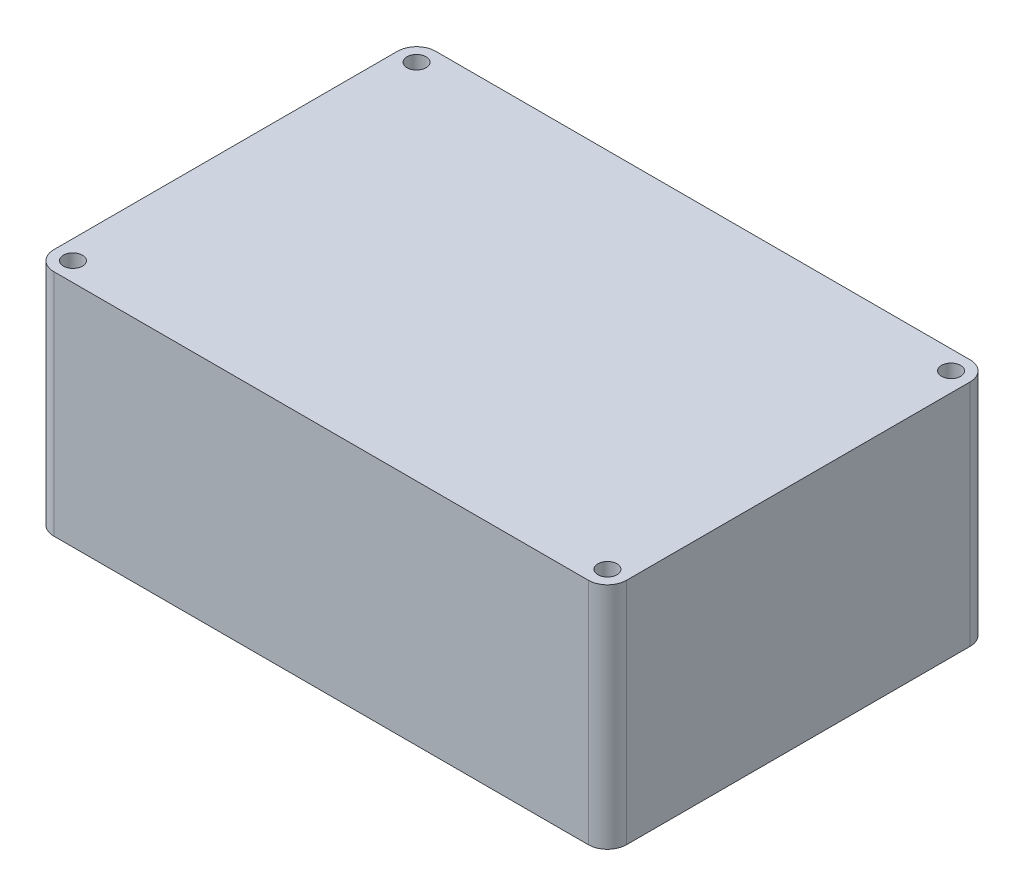
ISO-10303-21;
HEADER;
FILE_DESCRIPTION(('STEP AP214'),'2;1');
FILE_NAME('part.step','',(''),(''),'','','');
FILE_SCHEMA(('AUTOMOTIVE_DESIGN { 1 0 10303 214 1 1 1 1 }'));
ENDSEC;
DATA;
#1=APPLICATION_CONTEXT('core data for automotive mechanical design processes');
#2=APPLICATION_PROTOCOL_DEFINITION('international standard','automotive_design',2000,#1);
#3=PRODUCT_CONTEXT('',#1,'mechanical');
#4=PRODUCT('Part','Part','',(#3));
#5=PRODUCT_RELATED_PRODUCT_CATEGORY('part','',(#4));
#6=PRODUCT_DEFINITION_FORMATION('','',#4);
#7=PRODUCT_DEFINITION_CONTEXT('part definition',#1,'design');
#8=PRODUCT_DEFINITION('design','',#6,#7);
#9=PRODUCT_DEFINITION_SHAPE('','',#8);
#10=(LENGTH_UNIT() NAMED_UNIT(*) SI_UNIT(.MILLI.,.METRE.));
#11=(NAMED_UNIT(*) PLANE_ANGLE_UNIT() SI_UNIT($,.RADIAN.));
#12=(NAMED_UNIT(*) SI_UNIT($,.STERADIAN.) SOLID_ANGLE_UNIT());
#13=UNCERTAINTY_MEASURE_WITH_UNIT(LENGTH_MEASURE(1.E-05),#10,'distance_accuracy_value','');
#14=(GEOMETRIC_REPRESENTATION_CONTEXT(3) GLOBAL_UNCERTAINTY_ASSIGNED_CONTEXT((#13)) GLOBAL_UNIT_ASSIGNED_CONTEXT((#10,
#11,#12)) REPRESENTATION_CONTEXT('',''));
#15=CARTESIAN_POINT('',(0.,0.,0.));
#16=DIRECTION('',(0.,0.,1.));
#17=DIRECTION('',(1.,0.,0.));
#18=AXIS2_PLACEMENT_3D('',#15,#16,#17);
#19=CARTESIAN_POINT('',(-150.,120.,-100.));
#20=DIRECTION('',(1.,0.,0.));
#21=DIRECTION('',(0.,0.,-1.));
#22=AXIS2_PLACEMENT_3D('',#19,#20,#21);
#23=PLANE('',#22);
#24=DIRECTION('',(0.,0.,1.));
#25=VECTOR('',#24,1.);
#26=CARTESIAN_POINT('',(-150.,120.,-100.));
#27=LINE('',#26,#25);
#28=CARTESIAN_POINT('',(-150.,120.,-90.));
#29=VERTEX_POINT('',#28);
#30=CARTESIAN_POINT('',(-150.,120.,90.));
#31=VERTEX_POINT('',#30);
#32=EDGE_CURVE('E124',#29,#31,#27,.T.);
#33=ORIENTED_EDGE('',*,*,#32,.F.);
#34=DIRECTION('',(0.,-1.,0.));
#35=VECTOR('',#34,1.);
#36=CARTESIAN_POINT('',(-150.,120.,-90.));
#37=LINE('',#36,#35);
#38=CARTESIAN_POINT('',(-150.,0.,-90.));
#39=VERTEX_POINT('',#38);
#40=EDGE_CURVE('E109',#29,#39,#37,.T.);
#41=ORIENTED_EDGE('',*,*,#40,.T.);
#42=DIRECTION('',(0.,0.,1.));
#43=VECTOR('',#42,1.);
#44=CARTESIAN_POINT('',(-150.,0.,-100.));
#45=LINE('',#44,#43);
#46=CARTESIAN_POINT('',(-150.,0.,90.));
#47=VERTEX_POINT('',#46);
#48=EDGE_CURVE('E121',#39,#47,#45,.T.);
#49=ORIENTED_EDGE('',*,*,#48,.T.);
#50=DIRECTION('',(0.,-1.,0.));
#51=VECTOR('',#50,1.);
#52=CARTESIAN_POINT('',(-150.,120.,90.));
#53=LINE('',#52,#51);
#54=EDGE_CURVE('E126',#47,#31,#53,.F.);
#55=ORIENTED_EDGE('',*,*,#54,.T.);
#56=EDGE_LOOP('',(#33,#41,#49,#55));
#57=FACE_BOUND('',#56,.T.);
#58=ADVANCED_FACE('F39',(#57),#23,.F.);
#59=CARTESIAN_POINT('',(-150.,120.,100.));
#60=DIRECTION('',(0.,0.,-1.));
#61=DIRECTION('',(-1.,0.,0.));
#62=AXIS2_PLACEMENT_3D('',#59,#60,#61);
#63=PLANE('',#62);
#64=DIRECTION('',(1.,0.,0.));
#65=VECTOR('',#64,1.);
#66=CARTESIAN_POINT('',(-150.,0.,100.));
#67=LINE('',#66,#65);
#68=CARTESIAN_POINT('',(-140.,0.,100.));
#69=VERTEX_POINT('',#68);
#70=CARTESIAN_POINT('',(140.,0.,100.));
#71=VERTEX_POINT('',#70);
#72=EDGE_CURVE('E130',#69,#71,#67,.T.);
#73=ORIENTED_EDGE('',*,*,#72,.T.);
#74=DIRECTION('',(0.,-1.,0.));
#75=VECTOR('',#74,1.);
#76=CARTESIAN_POINT('',(140.,120.,100.));
#77=LINE('',#76,#75);
#78=CARTESIAN_POINT('',(140.,120.,100.));
#79=VERTEX_POINT('',#78);
#80=EDGE_CURVE('E11',#71,#79,#77,.F.);
#81=ORIENTED_EDGE('',*,*,#80,.T.);
#82=DIRECTION('',(1.,0.,0.));
#83=VECTOR('',#82,1.);
#84=CARTESIAN_POINT('',(-150.,120.,100.));
#85=LINE('',#84,#83);
#86=CARTESIAN_POINT('',(-140.,120.,100.));
#87=VERTEX_POINT('',#86);
#88=EDGE_CURVE('E170',#87,#79,#85,.T.);
#89=ORIENTED_EDGE('',*,*,#88,.F.);
#90=DIRECTION('',(0.,-1.,0.));
#91=VECTOR('',#90,1.);
#92=CARTESIAN_POINT('',(-140.,120.,100.));
#93=LINE('',#92,#91);
#94=EDGE_CURVE('E47',#87,#69,#93,.T.);
#95=ORIENTED_EDGE('',*,*,#94,.T.);
#96=EDGE_LOOP('',(#73,#81,#89,#95));
#97=FACE_BOUND('',#96,.T.);
#98=ADVANCED_FACE('F168',(#97),#63,.F.);
#99=CARTESIAN_POINT('',(150.,120.,-100.));
#100=DIRECTION('',(-1.,0.,0.));
#101=DIRECTION('',(0.,0.,1.));
#102=AXIS2_PLACEMENT_3D('',#99,#100,#101);
#103=PLANE('',#102);
#104=DIRECTION('',(0.,0.,-1.));
#105=VECTOR('',#104,1.);
#106=CARTESIAN_POINT('',(150.,0.,-100.));
#107=LINE('',#106,#105);
#108=CARTESIAN_POINT('',(150.,0.,90.));
#109=VERTEX_POINT('',#108);
#110=CARTESIAN_POINT('',(150.,0.,-90.));
#111=VERTEX_POINT('',#110);
#112=EDGE_CURVE('E134',#109,#111,#107,.T.);
#113=ORIENTED_EDGE('',*,*,#112,.T.);
#114=DIRECTION('',(0.,-1.,0.));
#115=VECTOR('',#114,1.);
#116=CARTESIAN_POINT('',(150.,120.,-90.));
#117=LINE('',#116,#115);
#118=CARTESIAN_POINT('',(150.,120.,-90.));
#119=VERTEX_POINT('',#118);
#120=EDGE_CURVE('E54',#111,#119,#117,.F.);
#121=ORIENTED_EDGE('',*,*,#120,.T.);
#122=DIRECTION('',(0.,0.,-1.));
#123=VECTOR('',#122,1.);
#124=CARTESIAN_POINT('',(150.,120.,-100.));
#125=LINE('',#124,#123);
#126=CARTESIAN_POINT('',(150.,120.,90.));
#127=VERTEX_POINT('',#126);
#128=EDGE_CURVE('E178',#127,#119,#125,.T.);
#129=ORIENTED_EDGE('',*,*,#128,.F.);
#130=DIRECTION('',(0.,-1.,0.));
#131=VECTOR('',#130,1.);
#132=CARTESIAN_POINT('',(150.,120.,90.));
#133=LINE('',#132,#131);
#134=EDGE_CURVE('E161',#127,#109,#133,.T.);
#135=ORIENTED_EDGE('',*,*,#134,.T.);
#136=EDGE_LOOP('',(#113,#121,#129,#135));
#137=FACE_BOUND('',#136,.T.);
#138=ADVANCED_FACE('F177',(#137),#103,.F.);
#139=CARTESIAN_POINT('',(-150.,120.,-100.));
#140=DIRECTION('',(0.,0.,1.));
#141=DIRECTION('',(1.,0.,0.));
#142=AXIS2_PLACEMENT_3D('',#139,#140,#141);
#143=PLANE('',#142);
#144=DIRECTION('',(-1.,0.,0.));
#145=VECTOR('',#144,1.);
#146=CARTESIAN_POINT('',(-150.,0.,-100.));
#147=LINE('',#146,#145);
#148=CARTESIAN_POINT('',(140.,0.,-100.));
#149=VERTEX_POINT('',#148);
#150=CARTESIAN_POINT('',(-140.,0.,-100.));
#151=VERTEX_POINT('',#150);
#152=EDGE_CURVE('E144',#149,#151,#147,.T.);
#153=ORIENTED_EDGE('',*,*,#152,.T.);
#154=DIRECTION('',(0.,-1.,0.));
#155=VECTOR('',#154,1.);
#156=CARTESIAN_POINT('',(-140.,120.,-100.));
#157=LINE('',#156,#155);
#158=CARTESIAN_POINT('',(-140.,120.,-100.));
#159=VERTEX_POINT('',#158);
#160=EDGE_CURVE('E110',#151,#159,#157,.F.);
#161=ORIENTED_EDGE('',*,*,#160,.T.);
#162=DIRECTION('',(-1.,0.,0.));
#163=VECTOR('',#162,1.);
#164=CARTESIAN_POINT('',(-150.,120.,-100.));
#165=LINE('',#164,#163);
#166=CARTESIAN_POINT('',(140.,120.,-100.));
#167=VERTEX_POINT('',#166);
#168=EDGE_CURVE('E140',#167,#159,#165,.T.);
#169=ORIENTED_EDGE('',*,*,#168,.F.);
#170=DIRECTION('',(0.,-1.,0.));
#171=VECTOR('',#170,1.);
#172=CARTESIAN_POINT('',(140.,120.,-100.));
#173=LINE('',#172,#171);
#174=EDGE_CURVE('E115',#167,#149,#173,.T.);
#175=ORIENTED_EDGE('',*,*,#174,.T.);
#176=EDGE_LOOP('',(#153,#161,#169,#175));
#177=FACE_BOUND('',#176,.T.);
#178=ADVANCED_FACE('F217',(#177),#143,.F.);
#179=CARTESIAN_POINT('',(0.,120.,0.));
#180=DIRECTION('',(0.,1.,0.));
#181=DIRECTION('',(0.,0.,1.));
#182=AXIS2_PLACEMENT_3D('',#179,#180,#181);
#183=PLANE('',#182);
#184=CARTESIAN_POINT('',(140.,120.,90.));
#185=DIRECTION('',(0.,1.,0.));
#186=DIRECTION('',(0.,0.,-1.));
#187=AXIS2_PLACEMENT_3D('',#184,#185,#186);
#188=CIRCLE('',#187,4.99999999999999);
#189=CARTESIAN_POINT('',(140.,120.,85.));
#190=VERTEX_POINT('',#189);
#191=EDGE_CURVE('E199',#190,#190,#188,.T.);
#192=ORIENTED_EDGE('',*,*,#191,.F.);
#193=EDGE_LOOP('',(#192));
#194=FACE_BOUND('',#193,.T.);
#195=CARTESIAN_POINT('',(-140.,120.,90.));
#196=DIRECTION('',(0.,-1.,0.));
#197=DIRECTION('',(0.,0.,-1.));
#198=AXIS2_PLACEMENT_3D('',#195,#196,#197);
#199=CIRCLE('',#198,4.99999999999999);
#200=CARTESIAN_POINT('',(-140.,120.,85.));
#201=VERTEX_POINT('',#200);
#202=EDGE_CURVE('E193',#201,#201,#199,.T.);
#203=ORIENTED_EDGE('',*,*,#202,.T.);
#204=EDGE_LOOP('',(#203));
#205=FACE_BOUND('',#204,.T.);
#206=CARTESIAN_POINT('',(140.,120.,-90.));
#207=DIRECTION('',(0.,-1.,0.));
#208=DIRECTION('',(0.,0.,1.));
#209=AXIS2_PLACEMENT_3D('',#206,#207,#208);
#210=CIRCLE('',#209,4.99999999999999);
#211=CARTESIAN_POINT('',(140.,120.,-85.));
#212=VERTEX_POINT('',#211);
#213=EDGE_CURVE('E187',#212,#212,#210,.T.);
#214=ORIENTED_EDGE('',*,*,#213,.T.);
#215=EDGE_LOOP('',(#214));
#216=FACE_BOUND('',#215,.T.);
#217=CARTESIAN_POINT('',(-140.,120.,-90.));
#218=DIRECTION('',(0.,1.,0.));
#219=DIRECTION('',(0.,0.,1.));
#220=AXIS2_PLACEMENT_3D('',#217,#218,#219);
#221=CIRCLE('',#220,4.99999999999999);
#222=CARTESIAN_POINT('',(-140.,120.,-85.));
#223=VERTEX_POINT('',#222);
#224=EDGE_CURVE('E137',#223,#223,#221,.T.);
#225=ORIENTED_EDGE('',*,*,#224,.F.);
#226=EDGE_LOOP('',(#225));
#227=FACE_BOUND('',#226,.T.);
#228=ORIENTED_EDGE('',*,*,#168,.T.);
#229=CARTESIAN_POINT('',(-140.,120.,-90.));
#230=DIRECTION('',(0.,1.,0.));
#231=DIRECTION('',(0.,0.,1.));
#232=AXIS2_PLACEMENT_3D('',#229,#230,#231);
#233=CIRCLE('',#232,10.);
#234=EDGE_CURVE('E159',#159,#29,#233,.T.);
#235=ORIENTED_EDGE('',*,*,#234,.T.);
#236=ORIENTED_EDGE('',*,*,#32,.T.);
#237=CARTESIAN_POINT('',(-140.,120.,90.));
#238=DIRECTION('',(0.,1.,0.));
#239=DIRECTION('',(0.,0.,1.));
#240=AXIS2_PLACEMENT_3D('',#237,#238,#239);
#241=CIRCLE('',#240,10.);
#242=EDGE_CURVE('E154',#31,#87,#241,.T.);
#243=ORIENTED_EDGE('',*,*,#242,.T.);
#244=ORIENTED_EDGE('',*,*,#88,.T.);
#245=CARTESIAN_POINT('',(140.,120.,90.));
#246=DIRECTION('',(0.,1.,0.));
#247=DIRECTION('',(0.,0.,1.));
#248=AXIS2_PLACEMENT_3D('',#245,#246,#247);
#249=CIRCLE('',#248,10.);
#250=EDGE_CURVE('E61',#79,#127,#249,.T.);
#251=ORIENTED_EDGE('',*,*,#250,.T.);
#252=ORIENTED_EDGE('',*,*,#128,.T.);
#253=CARTESIAN_POINT('',(140.,120.,-90.));
#254=DIRECTION('',(0.,1.,0.));
#255=DIRECTION('',(0.,0.,1.));
#256=AXIS2_PLACEMENT_3D('',#253,#254,#255);
#257=CIRCLE('',#256,10.);
#258=EDGE_CURVE('E157',#119,#167,#257,.T.);
#259=ORIENTED_EDGE('',*,*,#258,.T.);
#260=EDGE_LOOP('',(#228,#235,#236,#243,#244,#251,#252,#259));
#261=FACE_BOUND('',#260,.T.);
#262=ADVANCED_FACE('F214',(#194,#205,#216,#227,#261),#183,.T.);
#263=CARTESIAN_POINT('',(0.,0.,0.));
#264=DIRECTION('',(0.,1.,0.));
#265=DIRECTION('',(0.,0.,1.));
#266=AXIS2_PLACEMENT_3D('',#263,#264,#265);
#267=PLANE('',#266);
#268=CARTESIAN_POINT('',(140.,0.,90.));
#269=DIRECTION('',(0.,1.,0.));
#270=DIRECTION('',(0.,0.,-1.));
#271=AXIS2_PLACEMENT_3D('',#268,#269,#270);
#272=CIRCLE('',#271,4.99999999999999);
#273=CARTESIAN_POINT('',(140.,0.,85.));
#274=VERTEX_POINT('',#273);
#275=EDGE_CURVE('E196',#274,#274,#272,.T.);
#276=ORIENTED_EDGE('',*,*,#275,.T.);
#277=EDGE_LOOP('',(#276));
#278=FACE_BOUND('',#277,.T.);
#279=CARTESIAN_POINT('',(-140.,0.,90.));
#280=DIRECTION('',(0.,-1.,0.));
#281=DIRECTION('',(0.,0.,-1.));
#282=AXIS2_PLACEMENT_3D('',#279,#280,#281);
#283=CIRCLE('',#282,4.99999999999999);
#284=CARTESIAN_POINT('',(-140.,0.,85.));
#285=VERTEX_POINT('',#284);
#286=EDGE_CURVE('E190',#285,#285,#283,.T.);
#287=ORIENTED_EDGE('',*,*,#286,.F.);
#288=EDGE_LOOP('',(#287));
#289=FACE_BOUND('',#288,.T.);
#290=CARTESIAN_POINT('',(140.,0.,-90.));
#291=DIRECTION('',(0.,-1.,0.));
#292=DIRECTION('',(0.,0.,1.));
#293=AXIS2_PLACEMENT_3D('',#290,#291,#292);
#294=CIRCLE('',#293,4.99999999999999);
#295=CARTESIAN_POINT('',(140.,0.,-85.));
#296=VERTEX_POINT('',#295);
#297=EDGE_CURVE('E185',#296,#296,#294,.T.);
#298=ORIENTED_EDGE('',*,*,#297,.F.);
#299=EDGE_LOOP('',(#298));
#300=FACE_BOUND('',#299,.T.);
#301=CARTESIAN_POINT('',(-140.,0.,-90.));
#302=DIRECTION('',(0.,1.,0.));
#303=DIRECTION('',(0.,0.,1.));
#304=AXIS2_PLACEMENT_3D('',#301,#302,#303);
#305=CIRCLE('',#304,4.99999999999999);
#306=CARTESIAN_POINT('',(-140.,0.,-85.));
#307=VERTEX_POINT('',#306);
#308=EDGE_CURVE('E131',#307,#307,#305,.T.);
#309=ORIENTED_EDGE('',*,*,#308,.T.);
#310=EDGE_LOOP('',(#309));
#311=FACE_BOUND('',#310,.T.);
#312=ORIENTED_EDGE('',*,*,#48,.F.);
#313=CARTESIAN_POINT('',(-140.,0.,-90.));
#314=DIRECTION('',(0.,1.,0.));
#315=DIRECTION('',(0.,0.,1.));
#316=AXIS2_PLACEMENT_3D('',#313,#314,#315);
#317=CIRCLE('',#316,10.);
#318=EDGE_CURVE('E105',#39,#151,#317,.F.);
#319=ORIENTED_EDGE('',*,*,#318,.T.);
#320=ORIENTED_EDGE('',*,*,#152,.F.);
#321=CARTESIAN_POINT('',(140.,0.,-90.));
#322=DIRECTION('',(0.,1.,0.));
#323=DIRECTION('',(0.,0.,1.));
#324=AXIS2_PLACEMENT_3D('',#321,#322,#323);
#325=CIRCLE('',#324,10.);
#326=EDGE_CURVE('E116',#149,#111,#325,.F.);
#327=ORIENTED_EDGE('',*,*,#326,.T.);
#328=ORIENTED_EDGE('',*,*,#112,.F.);
#329=CARTESIAN_POINT('',(140.,0.,90.));
#330=DIRECTION('',(0.,1.,0.));
#331=DIRECTION('',(0.,0.,1.));
#332=AXIS2_PLACEMENT_3D('',#329,#330,#331);
#333=CIRCLE('',#332,10.);
#334=EDGE_CURVE('E148',#109,#71,#333,.F.);
#335=ORIENTED_EDGE('',*,*,#334,.T.);
#336=ORIENTED_EDGE('',*,*,#72,.F.);
#337=CARTESIAN_POINT('',(-140.,0.,90.));
#338=DIRECTION('',(0.,1.,0.));
#339=DIRECTION('',(0.,0.,1.));
#340=AXIS2_PLACEMENT_3D('',#337,#338,#339);
#341=CIRCLE('',#340,10.);
#342=EDGE_CURVE('E125',#69,#47,#341,.F.);
#343=ORIENTED_EDGE('',*,*,#342,.T.);
#344=EDGE_LOOP('',(#312,#319,#320,#327,#328,#335,#336,#343));
#345=FACE_BOUND('',#344,.T.);
#346=ADVANCED_FACE('F128',(#278,#289,#300,#311,#345),#267,.F.);
#347=CARTESIAN_POINT('',(-140.,120.,-90.));
#348=DIRECTION('',(0.,-1.,0.));
#349=DIRECTION('',(0.,0.,-1.));
#350=AXIS2_PLACEMENT_3D('',#347,#348,#349);
#351=CYLINDRICAL_SURFACE('',#350,10.);
#352=ORIENTED_EDGE('',*,*,#234,.F.);
#353=ORIENTED_EDGE('',*,*,#160,.F.);
#354=ORIENTED_EDGE('',*,*,#318,.F.);
#355=ORIENTED_EDGE('',*,*,#40,.F.);
#356=EDGE_LOOP('',(#352,#353,#354,#355));
#357=FACE_BOUND('',#356,.T.);
#358=ADVANCED_FACE('F108',(#357),#351,.T.);
#359=CARTESIAN_POINT('',(140.,120.,-90.));
#360=DIRECTION('',(0.,-1.,0.));
#361=DIRECTION('',(0.,0.,-1.));
#362=AXIS2_PLACEMENT_3D('',#359,#360,#361);
#363=CYLINDRICAL_SURFACE('',#362,10.);
#364=ORIENTED_EDGE('',*,*,#258,.F.);
#365=ORIENTED_EDGE('',*,*,#120,.F.);
#366=ORIENTED_EDGE('',*,*,#326,.F.);
#367=ORIENTED_EDGE('',*,*,#174,.F.);
#368=EDGE_LOOP('',(#364,#365,#366,#367));
#369=FACE_BOUND('',#368,.T.);
#370=ADVANCED_FACE('F228',(#369),#363,.T.);
#371=CARTESIAN_POINT('',(140.,120.,90.));
#372=DIRECTION('',(0.,-1.,0.));
#373=DIRECTION('',(0.,0.,-1.));
#374=AXIS2_PLACEMENT_3D('',#371,#372,#373);
#375=CYLINDRICAL_SURFACE('',#374,10.);
#376=ORIENTED_EDGE('',*,*,#250,.F.);
#377=ORIENTED_EDGE('',*,*,#80,.F.);
#378=ORIENTED_EDGE('',*,*,#334,.F.);
#379=ORIENTED_EDGE('',*,*,#134,.F.);
#380=EDGE_LOOP('',(#376,#377,#378,#379));
#381=FACE_BOUND('',#380,.T.);
#382=ADVANCED_FACE('F176',(#381),#375,.T.);
#383=CARTESIAN_POINT('',(-140.,120.,90.));
#384=DIRECTION('',(0.,-1.,0.));
#385=DIRECTION('',(0.,0.,-1.));
#386=AXIS2_PLACEMENT_3D('',#383,#384,#385);
#387=CYLINDRICAL_SURFACE('',#386,10.);
#388=ORIENTED_EDGE('',*,*,#242,.F.);
#389=ORIENTED_EDGE('',*,*,#54,.F.);
#390=ORIENTED_EDGE('',*,*,#342,.F.);
#391=ORIENTED_EDGE('',*,*,#94,.F.);
#392=EDGE_LOOP('',(#388,#389,#390,#391));
#393=FACE_BOUND('',#392,.T.);
#394=ADVANCED_FACE('F41',(#393),#387,.T.);
#395=CARTESIAN_POINT('',(-140.,0.,-90.));
#396=DIRECTION('',(0.,1.,0.));
#397=DIRECTION('',(0.,0.,1.));
#398=AXIS2_PLACEMENT_3D('',#395,#396,#397);
#399=CYLINDRICAL_SURFACE('',#398,4.99999999999999);
#400=ORIENTED_EDGE('',*,*,#308,.F.);
#401=EDGE_LOOP('',(#400));
#402=FACE_BOUND('',#401,.T.);
#403=ORIENTED_EDGE('',*,*,#224,.T.);
#404=EDGE_LOOP('',(#403));
#405=FACE_BOUND('',#404,.T.);
#406=ADVANCED_FACE('F249',(#402,#405),#399,.F.);
#407=CARTESIAN_POINT('',(140.,0.,-90.));
#408=DIRECTION('',(0.,1.,0.));
#409=DIRECTION('',(0.,0.,1.));
#410=AXIS2_PLACEMENT_3D('',#407,#408,#409);
#411=CYLINDRICAL_SURFACE('',#410,4.99999999999999);
#412=ORIENTED_EDGE('',*,*,#297,.T.);
#413=EDGE_LOOP('',(#412));
#414=FACE_BOUND('',#413,.T.);
#415=ORIENTED_EDGE('',*,*,#213,.F.);
#416=EDGE_LOOP('',(#415));
#417=FACE_BOUND('',#416,.T.);
#418=ADVANCED_FACE('F252',(#414,#417),#411,.F.);
#419=CARTESIAN_POINT('',(-140.,0.,90.));
#420=DIRECTION('',(0.,1.,0.));
#421=DIRECTION('',(0.,0.,1.));
#422=AXIS2_PLACEMENT_3D('',#419,#420,#421);
#423=CYLINDRICAL_SURFACE('',#422,4.99999999999999);
#424=ORIENTED_EDGE('',*,*,#286,.T.);
#425=EDGE_LOOP('',(#424));
#426=FACE_BOUND('',#425,.T.);
#427=ORIENTED_EDGE('',*,*,#202,.F.);
#428=EDGE_LOOP('',(#427));
#429=FACE_BOUND('',#428,.T.);
#430=ADVANCED_FACE('F210',(#426,#429),#423,.F.);
#431=CARTESIAN_POINT('',(140.,0.,90.));
#432=DIRECTION('',(0.,1.,0.));
#433=DIRECTION('',(0.,0.,1.));
#434=AXIS2_PLACEMENT_3D('',#431,#432,#433);
#435=CYLINDRICAL_SURFACE('',#434,4.99999999999999);
#436=ORIENTED_EDGE('',*,*,#275,.F.);
#437=EDGE_LOOP('',(#436));
#438=FACE_BOUND('',#437,.T.);
#439=ORIENTED_EDGE('',*,*,#191,.T.);
#440=EDGE_LOOP('',(#439));
#441=FACE_BOUND('',#440,.T.);
#442=ADVANCED_FACE('F207',(#438,#441),#435,.F.);
#443=CLOSED_SHELL('',(#58,#98,#138,#178,#262,#346,#358,#370,#382,#394,#406,#418,#430,#442));
#444=MANIFOLD_SOLID_BREP('B2',#443);
#445=ADVANCED_BREP_SHAPE_REPRESENTATION('',(#18,#444),#14);
#446=SHAPE_DEFINITION_REPRESENTATION(#9,#445);
ENDSEC;
END-ISO-10303-21;
